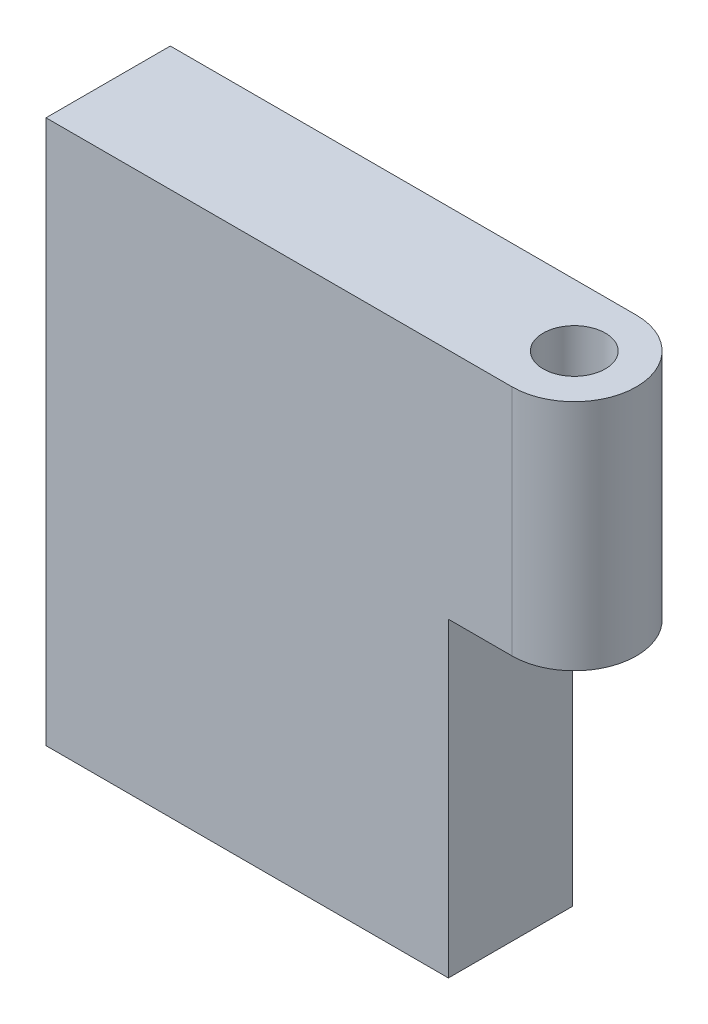
ISO-10303-21;
HEADER;
FILE_DESCRIPTION(('STEP AP214'),'2;1');
FILE_NAME('part.step','',(''),(''),'','','');
FILE_SCHEMA(('AUTOMOTIVE_DESIGN { 1 0 10303 214 1 1 1 1 }'));
ENDSEC;
DATA;
#1=APPLICATION_CONTEXT('core data for automotive mechanical design processes');
#2=APPLICATION_PROTOCOL_DEFINITION('international standard','automotive_design',2000,#1);
#3=PRODUCT_CONTEXT('',#1,'mechanical');
#4=PRODUCT('Part','Part','',(#3));
#5=PRODUCT_RELATED_PRODUCT_CATEGORY('part','',(#4));
#6=PRODUCT_DEFINITION_FORMATION('','',#4);
#7=PRODUCT_DEFINITION_CONTEXT('part definition',#1,'design');
#8=PRODUCT_DEFINITION('design','',#6,#7);
#9=PRODUCT_DEFINITION_SHAPE('','',#8);
#10=(LENGTH_UNIT() NAMED_UNIT(*) SI_UNIT(.MILLI.,.METRE.));
#11=(NAMED_UNIT(*) PLANE_ANGLE_UNIT() SI_UNIT($,.RADIAN.));
#12=(NAMED_UNIT(*) SI_UNIT($,.STERADIAN.) SOLID_ANGLE_UNIT());
#13=UNCERTAINTY_MEASURE_WITH_UNIT(LENGTH_MEASURE(1.E-05),#10,'distance_accuracy_value','');
#14=(GEOMETRIC_REPRESENTATION_CONTEXT(3) GLOBAL_UNCERTAINTY_ASSIGNED_CONTEXT((#13)) GLOBAL_UNIT_ASSIGNED_CONTEXT((#10,
#11,#12)) REPRESENTATION_CONTEXT('',''));
#15=CARTESIAN_POINT('',(0.,0.,0.));
#16=DIRECTION('',(0.,0.,1.));
#17=DIRECTION('',(1.,0.,0.));
#18=AXIS2_PLACEMENT_3D('',#15,#16,#17);
#19=CARTESIAN_POINT('',(0.,0.,0.));
#20=DIRECTION('',(0.,1.,0.));
#21=DIRECTION('',(0.,0.,1.));
#22=AXIS2_PLACEMENT_3D('',#19,#20,#21);
#23=PLANE('',#22);
#24=CARTESIAN_POINT('',(0.,0.,0.));
#25=DIRECTION('',(0.,1.,0.));
#26=DIRECTION('',(0.,0.,1.));
#27=AXIS2_PLACEMENT_3D('',#24,#25,#26);
#28=CIRCLE('',#27,2.);
#29=CARTESIAN_POINT('',(0.,0.,2.));
#30=VERTEX_POINT('',#29);
#31=EDGE_CURVE('E127',#30,#30,#28,.T.);
#32=ORIENTED_EDGE('',*,*,#31,.T.);
#33=EDGE_LOOP('',(#32));
#34=FACE_BOUND('',#33,.T.);
#35=DIRECTION('',(0.,0.,1.));
#36=VECTOR('',#35,1.);
#37=CARTESIAN_POINT('',(-4.1,0.,4.00000000000001));
#38=LINE('',#37,#36);
#39=CARTESIAN_POINT('',(-4.1,0.,-4.00000000000001));
#40=VERTEX_POINT('',#39);
#41=CARTESIAN_POINT('',(-4.1,0.,4.00000000000001));
#42=VERTEX_POINT('',#41);
#43=EDGE_CURVE('E49',#40,#42,#38,.T.);
#44=ORIENTED_EDGE('',*,*,#43,.F.);
#45=DIRECTION('',(-1.,0.,0.));
#46=VECTOR('',#45,1.);
#47=CARTESIAN_POINT('',(0.,0.,-4.00000000000001));
#48=LINE('',#47,#46);
#49=CARTESIAN_POINT('',(0.,0.,-4.00000000000001));
#50=VERTEX_POINT('',#49);
#51=EDGE_CURVE('E136',#50,#40,#48,.T.);
#52=ORIENTED_EDGE('',*,*,#51,.F.);
#53=CARTESIAN_POINT('',(0.,0.,0.));
#54=DIRECTION('',(0.,1.,0.));
#55=DIRECTION('',(0.,0.,1.));
#56=AXIS2_PLACEMENT_3D('',#53,#54,#55);
#57=CIRCLE('',#56,4.);
#58=CARTESIAN_POINT('',(0.,0.,4.00000000000001));
#59=VERTEX_POINT('',#58);
#60=EDGE_CURVE('E73',#59,#50,#57,.T.);
#61=ORIENTED_EDGE('',*,*,#60,.F.);
#62=DIRECTION('',(-1.,0.,0.));
#63=VECTOR('',#62,1.);
#64=CARTESIAN_POINT('',(0.,0.,4.00000000000001));
#65=LINE('',#64,#63);
#66=EDGE_CURVE('E130',#59,#42,#65,.T.);
#67=ORIENTED_EDGE('',*,*,#66,.T.);
#68=EDGE_LOOP('',(#44,#52,#61,#67));
#69=FACE_BOUND('',#68,.T.);
#70=ADVANCED_FACE('F34',(#34,#69),#23,.F.);
#71=CARTESIAN_POINT('',(0.,15.,4.00000000000001));
#72=DIRECTION('',(0.,0.,1.));
#73=DIRECTION('',(1.,0.,0.));
#74=AXIS2_PLACEMENT_3D('',#71,#72,#73);
#75=PLANE('',#74);
#76=ORIENTED_EDGE('',*,*,#66,.F.);
#77=DIRECTION('',(0.,-1.,0.));
#78=VECTOR('',#77,1.);
#79=CARTESIAN_POINT('',(0.,15.,4.00000000000001));
#80=LINE('',#79,#78);
#81=CARTESIAN_POINT('',(0.,15.,4.00000000000001));
#82=VERTEX_POINT('',#81);
#83=EDGE_CURVE('E11',#82,#59,#80,.T.);
#84=ORIENTED_EDGE('',*,*,#83,.F.);
#85=DIRECTION('',(-1.,0.,0.));
#86=VECTOR('',#85,1.);
#87=CARTESIAN_POINT('',(0.,15.,4.00000000000001));
#88=LINE('',#87,#86);
#89=CARTESIAN_POINT('',(-30.,15.,4.));
#90=VERTEX_POINT('',#89);
#91=EDGE_CURVE('E133',#82,#90,#88,.T.);
#92=ORIENTED_EDGE('',*,*,#91,.T.);
#93=DIRECTION('',(0.,-1.,0.));
#94=VECTOR('',#93,1.);
#95=CARTESIAN_POINT('',(-30.,15.,4.));
#96=LINE('',#95,#94);
#97=CARTESIAN_POINT('',(-30.,-20.,4.));
#98=VERTEX_POINT('',#97);
#99=EDGE_CURVE('E58',#90,#98,#96,.T.);
#100=ORIENTED_EDGE('',*,*,#99,.T.);
#101=DIRECTION('',(-1.,0.,0.));
#102=VECTOR('',#101,1.);
#103=CARTESIAN_POINT('',(-30.,-20.,4.));
#104=LINE('',#103,#102);
#105=CARTESIAN_POINT('',(-4.1,-20.,4.00000000000001));
#106=VERTEX_POINT('',#105);
#107=EDGE_CURVE('E116',#106,#98,#104,.T.);
#108=ORIENTED_EDGE('',*,*,#107,.F.);
#109=DIRECTION('',(0.,1.,0.));
#110=VECTOR('',#109,1.);
#111=CARTESIAN_POINT('',(-4.1,-20.,4.00000000000001));
#112=LINE('',#111,#110);
#113=EDGE_CURVE('E121',#106,#42,#112,.T.);
#114=ORIENTED_EDGE('',*,*,#113,.T.);
#115=EDGE_LOOP('',(#76,#84,#92,#100,#108,#114));
#116=FACE_BOUND('',#115,.T.);
#117=ADVANCED_FACE('F36',(#116),#75,.T.);
#118=CARTESIAN_POINT('',(0.,15.,0.));
#119=DIRECTION('',(0.,-1.,0.));
#120=DIRECTION('',(0.,0.,-1.));
#121=AXIS2_PLACEMENT_3D('',#118,#119,#120);
#122=CYLINDRICAL_SURFACE('',#121,4.);
#123=ORIENTED_EDGE('',*,*,#60,.T.);
#124=DIRECTION('',(0.,-1.,0.));
#125=VECTOR('',#124,1.);
#126=CARTESIAN_POINT('',(0.,15.,-4.00000000000001));
#127=LINE('',#126,#125);
#128=CARTESIAN_POINT('',(0.,15.,-4.00000000000001));
#129=VERTEX_POINT('',#128);
#130=EDGE_CURVE('E42',#129,#50,#127,.T.);
#131=ORIENTED_EDGE('',*,*,#130,.F.);
#132=CARTESIAN_POINT('',(0.,15.,0.));
#133=DIRECTION('',(0.,1.,0.));
#134=DIRECTION('',(0.,0.,1.));
#135=AXIS2_PLACEMENT_3D('',#132,#133,#134);
#136=CIRCLE('',#135,4.);
#137=EDGE_CURVE('E135',#82,#129,#136,.T.);
#138=ORIENTED_EDGE('',*,*,#137,.F.);
#139=ORIENTED_EDGE('',*,*,#83,.T.);
#140=EDGE_LOOP('',(#123,#131,#138,#139));
#141=FACE_BOUND('',#140,.T.);
#142=ADVANCED_FACE('F167',(#141),#122,.T.);
#143=CARTESIAN_POINT('',(0.,15.,-4.00000000000001));
#144=DIRECTION('',(0.,0.,1.));
#145=DIRECTION('',(1.,0.,0.));
#146=AXIS2_PLACEMENT_3D('',#143,#144,#145);
#147=PLANE('',#146);
#148=ORIENTED_EDGE('',*,*,#51,.T.);
#149=DIRECTION('',(0.,1.,0.));
#150=VECTOR('',#149,1.);
#151=CARTESIAN_POINT('',(-4.1,-20.,-4.));
#152=LINE('',#151,#150);
#153=CARTESIAN_POINT('',(-4.1,-20.,-4.));
#154=VERTEX_POINT('',#153);
#155=EDGE_CURVE('E108',#154,#40,#152,.T.);
#156=ORIENTED_EDGE('',*,*,#155,.F.);
#157=DIRECTION('',(1.,0.,0.));
#158=VECTOR('',#157,1.);
#159=CARTESIAN_POINT('',(-30.,-20.,-4.00000000000001));
#160=LINE('',#159,#158);
#161=CARTESIAN_POINT('',(-30.,-20.,-4.00000000000001));
#162=VERTEX_POINT('',#161);
#163=EDGE_CURVE('E105',#162,#154,#160,.T.);
#164=ORIENTED_EDGE('',*,*,#163,.F.);
#165=DIRECTION('',(0.,-1.,0.));
#166=VECTOR('',#165,1.);
#167=CARTESIAN_POINT('',(-30.,15.,-4.));
#168=LINE('',#167,#166);
#169=CARTESIAN_POINT('',(-30.,15.,-4.));
#170=VERTEX_POINT('',#169);
#171=EDGE_CURVE('E94',#170,#162,#168,.T.);
#172=ORIENTED_EDGE('',*,*,#171,.F.);
#173=DIRECTION('',(-1.,0.,0.));
#174=VECTOR('',#173,1.);
#175=CARTESIAN_POINT('',(0.,15.,-4.00000000000001));
#176=LINE('',#175,#174);
#177=EDGE_CURVE('E138',#129,#170,#176,.T.);
#178=ORIENTED_EDGE('',*,*,#177,.F.);
#179=ORIENTED_EDGE('',*,*,#130,.T.);
#180=EDGE_LOOP('',(#148,#156,#164,#172,#178,#179));
#181=FACE_BOUND('',#180,.T.);
#182=ADVANCED_FACE('F106',(#181),#147,.F.);
#183=CARTESIAN_POINT('',(-30.,15.,0.));
#184=DIRECTION('',(-1.,0.,0.));
#185=DIRECTION('',(0.,0.,1.));
#186=AXIS2_PLACEMENT_3D('',#183,#184,#185);
#187=PLANE('',#186);
#188=ORIENTED_EDGE('',*,*,#171,.T.);
#189=DIRECTION('',(0.,0.,-1.));
#190=VECTOR('',#189,1.);
#191=CARTESIAN_POINT('',(-30.,-20.,4.));
#192=LINE('',#191,#190);
#193=EDGE_CURVE('E98',#98,#162,#192,.T.);
#194=ORIENTED_EDGE('',*,*,#193,.F.);
#195=ORIENTED_EDGE('',*,*,#99,.F.);
#196=DIRECTION('',(0.,0.,-1.));
#197=VECTOR('',#196,1.);
#198=CARTESIAN_POINT('',(-30.,15.,0.));
#199=LINE('',#198,#197);
#200=EDGE_CURVE('E100',#90,#170,#199,.T.);
#201=ORIENTED_EDGE('',*,*,#200,.T.);
#202=EDGE_LOOP('',(#188,#194,#195,#201));
#203=FACE_BOUND('',#202,.T.);
#204=ADVANCED_FACE('F96',(#203),#187,.T.);
#205=CARTESIAN_POINT('',(0.,15.,0.));
#206=DIRECTION('',(0.,1.,0.));
#207=DIRECTION('',(0.,0.,1.));
#208=AXIS2_PLACEMENT_3D('',#205,#206,#207);
#209=PLANE('',#208);
#210=CARTESIAN_POINT('',(0.,15.,0.));
#211=DIRECTION('',(0.,1.,0.));
#212=DIRECTION('',(0.,0.,1.));
#213=AXIS2_PLACEMENT_3D('',#210,#211,#212);
#214=CIRCLE('',#213,2.);
#215=CARTESIAN_POINT('',(0.,15.,2.));
#216=VERTEX_POINT('',#215);
#217=EDGE_CURVE('E126',#216,#216,#214,.T.);
#218=ORIENTED_EDGE('',*,*,#217,.F.);
#219=EDGE_LOOP('',(#218));
#220=FACE_BOUND('',#219,.T.);
#221=ORIENTED_EDGE('',*,*,#91,.F.);
#222=ORIENTED_EDGE('',*,*,#137,.T.);
#223=ORIENTED_EDGE('',*,*,#177,.T.);
#224=ORIENTED_EDGE('',*,*,#200,.F.);
#225=EDGE_LOOP('',(#221,#222,#223,#224));
#226=FACE_BOUND('',#225,.T.);
#227=ADVANCED_FACE('F156',(#220,#226),#209,.T.);
#228=CARTESIAN_POINT('',(0.,0.,0.));
#229=DIRECTION('',(0.,1.,0.));
#230=DIRECTION('',(0.,0.,1.));
#231=AXIS2_PLACEMENT_3D('',#228,#229,#230);
#232=CYLINDRICAL_SURFACE('',#231,2.);
#233=ORIENTED_EDGE('',*,*,#31,.F.);
#234=EDGE_LOOP('',(#233));
#235=FACE_BOUND('',#234,.T.);
#236=ORIENTED_EDGE('',*,*,#217,.T.);
#237=EDGE_LOOP('',(#236));
#238=FACE_BOUND('',#237,.T.);
#239=ADVANCED_FACE('F148',(#235,#238),#232,.F.);
#240=CARTESIAN_POINT('',(-4.1,-20.,4.00000000000001));
#241=DIRECTION('',(-1.,0.,0.));
#242=DIRECTION('',(0.,0.,1.));
#243=AXIS2_PLACEMENT_3D('',#240,#241,#242);
#244=PLANE('',#243);
#245=ORIENTED_EDGE('',*,*,#43,.T.);
#246=ORIENTED_EDGE('',*,*,#113,.F.);
#247=DIRECTION('',(0.,0.,1.));
#248=VECTOR('',#247,1.);
#249=CARTESIAN_POINT('',(-4.1,-20.,4.00000000000001));
#250=LINE('',#249,#248);
#251=EDGE_CURVE('E111',#154,#106,#250,.T.);
#252=ORIENTED_EDGE('',*,*,#251,.F.);
#253=ORIENTED_EDGE('',*,*,#155,.T.);
#254=EDGE_LOOP('',(#245,#246,#252,#253));
#255=FACE_BOUND('',#254,.T.);
#256=ADVANCED_FACE('F146',(#255),#244,.F.);
#257=CARTESIAN_POINT('',(0.,-20.,0.));
#258=DIRECTION('',(0.,-1.,0.));
#259=DIRECTION('',(0.,0.,-1.));
#260=AXIS2_PLACEMENT_3D('',#257,#258,#259);
#261=PLANE('',#260);
#262=ORIENTED_EDGE('',*,*,#193,.T.);
#263=ORIENTED_EDGE('',*,*,#163,.T.);
#264=ORIENTED_EDGE('',*,*,#251,.T.);
#265=ORIENTED_EDGE('',*,*,#107,.T.);
#266=EDGE_LOOP('',(#262,#263,#264,#265));
#267=FACE_BOUND('',#266,.T.);
#268=ADVANCED_FACE('F114',(#267),#261,.T.);
#269=CLOSED_SHELL('',(#70,#117,#142,#182,#204,#227,#239,#256,#268));
#270=MANIFOLD_SOLID_BREP('B2',#269);
#271=ADVANCED_BREP_SHAPE_REPRESENTATION('',(#18,#270),#14);
#272=SHAPE_DEFINITION_REPRESENTATION(#9,#271);
ENDSEC;
END-ISO-10303-21;
